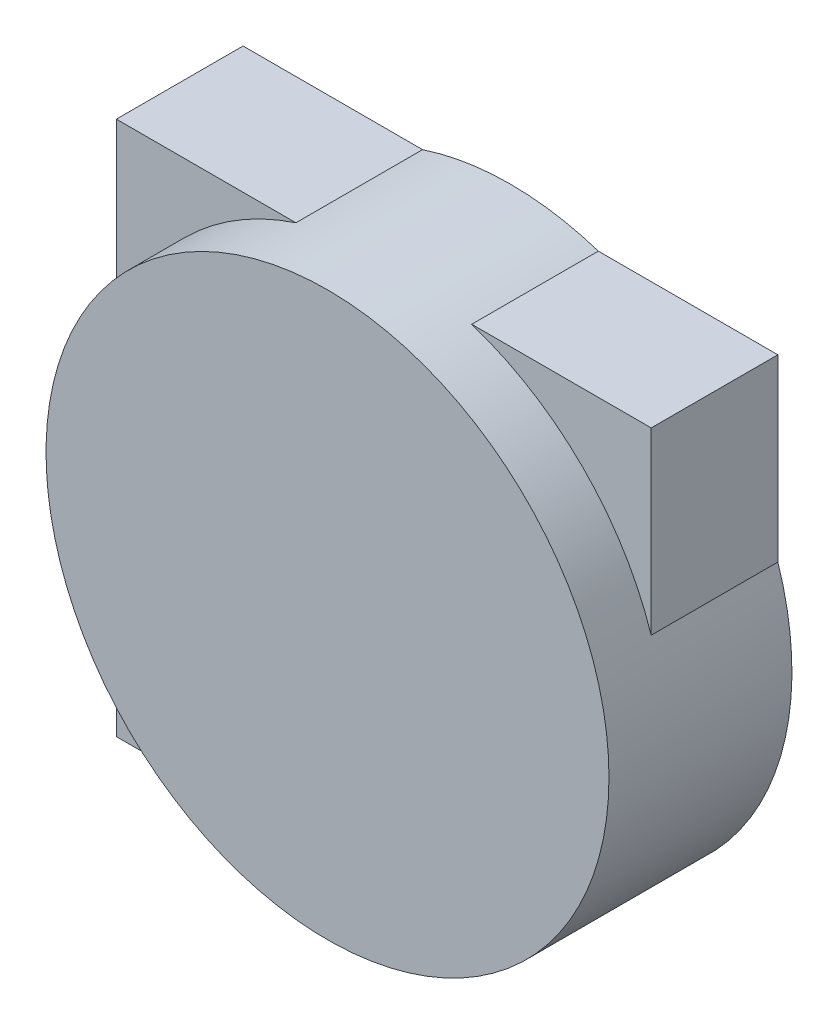
ISO-10303-21;
HEADER;
FILE_DESCRIPTION(('STEP AP214'),'2;1');
FILE_NAME('part.step','',(''),(''),'','','');
FILE_SCHEMA(('AUTOMOTIVE_DESIGN { 1 0 10303 214 1 1 1 1 }'));
ENDSEC;
DATA;
#1=APPLICATION_CONTEXT('core data for automotive mechanical design processes');
#2=APPLICATION_PROTOCOL_DEFINITION('international standard','automotive_design',2000,#1);
#3=PRODUCT_CONTEXT('',#1,'mechanical');
#4=PRODUCT('Part','Part','',(#3));
#5=PRODUCT_RELATED_PRODUCT_CATEGORY('part','',(#4));
#6=PRODUCT_DEFINITION_FORMATION('','',#4);
#7=PRODUCT_DEFINITION_CONTEXT('part definition',#1,'design');
#8=PRODUCT_DEFINITION('design','',#6,#7);
#9=PRODUCT_DEFINITION_SHAPE('','',#8);
#10=(LENGTH_UNIT() NAMED_UNIT(*) SI_UNIT(.MILLI.,.METRE.));
#11=(NAMED_UNIT(*) PLANE_ANGLE_UNIT() SI_UNIT($,.RADIAN.));
#12=(NAMED_UNIT(*) SI_UNIT($,.STERADIAN.) SOLID_ANGLE_UNIT());
#13=UNCERTAINTY_MEASURE_WITH_UNIT(LENGTH_MEASURE(1.E-05),#10,'distance_accuracy_value','');
#14=(GEOMETRIC_REPRESENTATION_CONTEXT(3) GLOBAL_UNCERTAINTY_ASSIGNED_CONTEXT((#13)) GLOBAL_UNIT_ASSIGNED_CONTEXT((#10,
#11,#12)) REPRESENTATION_CONTEXT('',''));
#15=CARTESIAN_POINT('',(0.,0.,0.));
#16=DIRECTION('',(0.,0.,1.));
#17=DIRECTION('',(1.,0.,0.));
#18=AXIS2_PLACEMENT_3D('',#15,#16,#17);
#19=CARTESIAN_POINT('',(0.,0.,13.));
#20=DIRECTION('',(0.,0.,-1.));
#21=DIRECTION('',(-1.,0.,0.));
#22=AXIS2_PLACEMENT_3D('',#19,#20,#21);
#23=CYLINDRICAL_SURFACE('',#22,20.);
#24=CARTESIAN_POINT('',(0.,0.,0.));
#25=DIRECTION('',(0.,0.,1.));
#26=DIRECTION('',(1.,0.,0.));
#27=AXIS2_PLACEMENT_3D('',#24,#25,#26);
#28=CIRCLE('',#27,20.);
#29=CARTESIAN_POINT('',(-6.24499799839837,-19.,0.));
#30=VERTEX_POINT('',#29);
#31=CARTESIAN_POINT('',(19.,6.2449979983984,0.));
#32=VERTEX_POINT('',#31);
#33=EDGE_CURVE('E160',#30,#32,#28,.T.);
#34=ORIENTED_EDGE('',*,*,#33,.T.);
#35=DIRECTION('',(0.,0.,-1.));
#36=VECTOR('',#35,1.);
#37=CARTESIAN_POINT('',(19.,6.2449979983984,13.));
#38=LINE('',#37,#36);
#39=CARTESIAN_POINT('',(19.,6.2449979983984,9.));
#40=VERTEX_POINT('',#39);
#41=EDGE_CURVE('E158',#32,#40,#38,.F.);
#42=ORIENTED_EDGE('',*,*,#41,.T.);
#43=CARTESIAN_POINT('',(0.,0.,9.));
#44=DIRECTION('',(0.,0.,-1.));
#45=DIRECTION('',(-1.,0.,0.));
#46=AXIS2_PLACEMENT_3D('',#43,#44,#45);
#47=CIRCLE('',#46,20.);
#48=CARTESIAN_POINT('',(6.24499799839839,19.,9.));
#49=VERTEX_POINT('',#48);
#50=EDGE_CURVE('E41',#49,#40,#47,.T.);
#51=ORIENTED_EDGE('',*,*,#50,.F.);
#52=DIRECTION('',(0.,0.,-1.));
#53=VECTOR('',#52,1.);
#54=CARTESIAN_POINT('',(6.24499799839839,19.,13.));
#55=LINE('',#54,#53);
#56=CARTESIAN_POINT('',(6.24499799839839,19.,0.));
#57=VERTEX_POINT('',#56);
#58=EDGE_CURVE('E155',#49,#57,#55,.T.);
#59=ORIENTED_EDGE('',*,*,#58,.T.);
#60=CARTESIAN_POINT('',(-6.24499799839839,19.,0.));
#61=VERTEX_POINT('',#60);
#62=EDGE_CURVE('E163',#57,#61,#28,.T.);
#63=ORIENTED_EDGE('',*,*,#62,.T.);
#64=DIRECTION('',(0.,0.,-1.));
#65=VECTOR('',#64,1.);
#66=CARTESIAN_POINT('',(-6.24499799839839,19.,13.));
#67=LINE('',#66,#65);
#68=CARTESIAN_POINT('',(-6.24499799839839,19.,9.));
#69=VERTEX_POINT('',#68);
#70=EDGE_CURVE('E48',#61,#69,#67,.F.);
#71=ORIENTED_EDGE('',*,*,#70,.T.);
#72=CARTESIAN_POINT('',(-19.,6.24499799839838,9.));
#73=VERTEX_POINT('',#72);
#74=EDGE_CURVE('E11',#73,#69,#47,.T.);
#75=ORIENTED_EDGE('',*,*,#74,.F.);
#76=DIRECTION('',(0.,0.,-1.));
#77=VECTOR('',#76,1.);
#78=CARTESIAN_POINT('',(-19.,6.24499799839839,13.));
#79=LINE('',#78,#77);
#80=CARTESIAN_POINT('',(-19.,6.24499799839839,0.));
#81=VERTEX_POINT('',#80);
#82=EDGE_CURVE('E152',#73,#81,#79,.T.);
#83=ORIENTED_EDGE('',*,*,#82,.T.);
#84=CARTESIAN_POINT('',(-19.,-6.24499799839838,0.));
#85=VERTEX_POINT('',#84);
#86=EDGE_CURVE('E164',#81,#85,#28,.T.);
#87=ORIENTED_EDGE('',*,*,#86,.T.);
#88=DIRECTION('',(0.,0.,-1.));
#89=VECTOR('',#88,1.);
#90=CARTESIAN_POINT('',(-19.,-6.24499799839838,13.));
#91=LINE('',#90,#89);
#92=CARTESIAN_POINT('',(-19.,-6.24499799839838,9.));
#93=VERTEX_POINT('',#92);
#94=EDGE_CURVE('E150',#85,#93,#91,.F.);
#95=ORIENTED_EDGE('',*,*,#94,.T.);
#96=CARTESIAN_POINT('',(-6.24499799839838,-19.,9.));
#97=VERTEX_POINT('',#96);
#98=EDGE_CURVE('E36',#97,#93,#47,.T.);
#99=ORIENTED_EDGE('',*,*,#98,.F.);
#100=DIRECTION('',(0.,0.,-1.));
#101=VECTOR('',#100,1.);
#102=CARTESIAN_POINT('',(-6.24499799839837,-19.,13.));
#103=LINE('',#102,#101);
#104=EDGE_CURVE('E109',#97,#30,#103,.T.);
#105=ORIENTED_EDGE('',*,*,#104,.T.);
#106=EDGE_LOOP('',(#34,#42,#51,#59,#63,#71,#75,#83,#87,#95,#99,#105));
#107=FACE_BOUND('',#106,.T.);
#108=CARTESIAN_POINT('',(0.,0.,13.));
#109=DIRECTION('',(0.,0.,1.));
#110=DIRECTION('',(1.,0.,0.));
#111=AXIS2_PLACEMENT_3D('',#108,#109,#110);
#112=CIRCLE('',#111,20.);
#113=CARTESIAN_POINT('',(20.,0.,13.));
#114=VERTEX_POINT('',#113);
#115=EDGE_CURVE('E161',#114,#114,#112,.T.);
#116=ORIENTED_EDGE('',*,*,#115,.F.);
#117=EDGE_LOOP('',(#116));
#118=FACE_BOUND('',#117,.T.);
#119=ADVANCED_FACE('F33',(#107,#118),#23,.T.);
#120=CARTESIAN_POINT('',(0.,0.,13.));
#121=DIRECTION('',(0.,0.,1.));
#122=DIRECTION('',(1.,0.,0.));
#123=AXIS2_PLACEMENT_3D('',#120,#121,#122);
#124=PLANE('',#123);
#125=ORIENTED_EDGE('',*,*,#115,.T.);
#126=EDGE_LOOP('',(#125));
#127=FACE_BOUND('',#126,.T.);
#128=ADVANCED_FACE('F198',(#127),#124,.T.);
#129=CARTESIAN_POINT('',(0.,0.,0.));
#130=DIRECTION('',(0.,0.,1.));
#131=DIRECTION('',(1.,0.,0.));
#132=AXIS2_PLACEMENT_3D('',#129,#130,#131);
#133=PLANE('',#132);
#134=ORIENTED_EDGE('',*,*,#33,.F.);
#135=DIRECTION('',(-1.,0.,0.));
#136=VECTOR('',#135,1.);
#137=CARTESIAN_POINT('',(6.24499799839837,-19.,0.));
#138=LINE('',#137,#136);
#139=CARTESIAN_POINT('',(-19.,-19.,0.));
#140=VERTEX_POINT('',#139);
#141=EDGE_CURVE('E136',#30,#140,#138,.T.);
#142=ORIENTED_EDGE('',*,*,#141,.T.);
#143=DIRECTION('',(0.,1.,0.));
#144=VECTOR('',#143,1.);
#145=CARTESIAN_POINT('',(-19.,19.,0.));
#146=LINE('',#145,#144);
#147=EDGE_CURVE('E122',#140,#85,#146,.T.);
#148=ORIENTED_EDGE('',*,*,#147,.T.);
#149=ORIENTED_EDGE('',*,*,#86,.F.);
#150=CARTESIAN_POINT('',(-19.,19.,0.));
#151=VERTEX_POINT('',#150);
#152=EDGE_CURVE('E138',#81,#151,#146,.T.);
#153=ORIENTED_EDGE('',*,*,#152,.T.);
#154=DIRECTION('',(1.,0.,0.));
#155=VECTOR('',#154,1.);
#156=CARTESIAN_POINT('',(19.,19.,0.));
#157=LINE('',#156,#155);
#158=EDGE_CURVE('E141',#151,#61,#157,.T.);
#159=ORIENTED_EDGE('',*,*,#158,.T.);
#160=ORIENTED_EDGE('',*,*,#62,.F.);
#161=CARTESIAN_POINT('',(19.,19.,0.));
#162=VERTEX_POINT('',#161);
#163=EDGE_CURVE('E140',#57,#162,#157,.T.);
#164=ORIENTED_EDGE('',*,*,#163,.T.);
#165=DIRECTION('',(0.,-1.,0.));
#166=VECTOR('',#165,1.);
#167=CARTESIAN_POINT('',(19.,19.,0.));
#168=LINE('',#167,#166);
#169=EDGE_CURVE('E133',#162,#32,#168,.T.);
#170=ORIENTED_EDGE('',*,*,#169,.T.);
#171=EDGE_LOOP('',(#134,#142,#148,#149,#153,#159,#160,#164,#170));
#172=FACE_BOUND('',#171,.T.);
#173=ADVANCED_FACE('F175',(#172),#133,.F.);
#174=CARTESIAN_POINT('',(0.,0.,9.));
#175=DIRECTION('',(0.,0.,-1.));
#176=DIRECTION('',(-1.,0.,0.));
#177=AXIS2_PLACEMENT_3D('',#174,#175,#176);
#178=PLANE('',#177);
#179=DIRECTION('',(-1.,0.,0.));
#180=VECTOR('',#179,1.);
#181=CARTESIAN_POINT('',(6.24499799839837,-19.,9.));
#182=LINE('',#181,#180);
#183=CARTESIAN_POINT('',(-19.,-19.,9.));
#184=VERTEX_POINT('',#183);
#185=EDGE_CURVE('E102',#97,#184,#182,.T.);
#186=ORIENTED_EDGE('',*,*,#185,.F.);
#187=ORIENTED_EDGE('',*,*,#98,.T.);
#188=DIRECTION('',(0.,1.,0.));
#189=VECTOR('',#188,1.);
#190=CARTESIAN_POINT('',(-19.,19.,9.));
#191=LINE('',#190,#189);
#192=EDGE_CURVE('E120',#184,#93,#191,.T.);
#193=ORIENTED_EDGE('',*,*,#192,.F.);
#194=EDGE_LOOP('',(#186,#187,#193));
#195=FACE_BOUND('',#194,.T.);
#196=ADVANCED_FACE('F126',(#195),#178,.F.);
#197=CARTESIAN_POINT('',(6.24499799839837,-19.,9.));
#198=DIRECTION('',(0.,-1.,0.));
#199=DIRECTION('',(1.,0.,0.));
#200=AXIS2_PLACEMENT_3D('',#197,#198,#199);
#201=PLANE('',#200);
#202=ORIENTED_EDGE('',*,*,#104,.F.);
#203=ORIENTED_EDGE('',*,*,#185,.T.);
#204=DIRECTION('',(0.,0.,-1.));
#205=VECTOR('',#204,1.);
#206=CARTESIAN_POINT('',(-19.,-19.,9.));
#207=LINE('',#206,#205);
#208=EDGE_CURVE('E106',#184,#140,#207,.T.);
#209=ORIENTED_EDGE('',*,*,#208,.T.);
#210=ORIENTED_EDGE('',*,*,#141,.F.);
#211=EDGE_LOOP('',(#202,#203,#209,#210));
#212=FACE_BOUND('',#211,.T.);
#213=ADVANCED_FACE('F104',(#212),#201,.T.);
#214=CARTESIAN_POINT('',(-19.,19.,9.));
#215=DIRECTION('',(-1.,0.,0.));
#216=DIRECTION('',(0.,-1.,0.));
#217=AXIS2_PLACEMENT_3D('',#214,#215,#216);
#218=PLANE('',#217);
#219=ORIENTED_EDGE('',*,*,#94,.F.);
#220=ORIENTED_EDGE('',*,*,#147,.F.);
#221=ORIENTED_EDGE('',*,*,#208,.F.);
#222=ORIENTED_EDGE('',*,*,#192,.T.);
#223=EDGE_LOOP('',(#219,#220,#221,#222));
#224=FACE_BOUND('',#223,.T.);
#225=ADVANCED_FACE('F119',(#224),#218,.T.);
#226=DIRECTION('',(1.,0.,0.));
#227=VECTOR('',#226,1.);
#228=CARTESIAN_POINT('',(19.,19.,9.));
#229=LINE('',#228,#227);
#230=CARTESIAN_POINT('',(19.,19.,9.));
#231=VERTEX_POINT('',#230);
#232=EDGE_CURVE('E127',#49,#231,#229,.T.);
#233=ORIENTED_EDGE('',*,*,#232,.F.);
#234=ORIENTED_EDGE('',*,*,#50,.T.);
#235=DIRECTION('',(0.,-1.,0.));
#236=VECTOR('',#235,1.);
#237=CARTESIAN_POINT('',(19.,19.,9.));
#238=LINE('',#237,#236);
#239=EDGE_CURVE('E114',#231,#40,#238,.T.);
#240=ORIENTED_EDGE('',*,*,#239,.F.);
#241=EDGE_LOOP('',(#233,#234,#240));
#242=FACE_BOUND('',#241,.T.);
#243=ADVANCED_FACE('F185',(#242),#178,.F.);
#244=CARTESIAN_POINT('',(19.,19.,9.));
#245=DIRECTION('',(0.,1.,0.));
#246=DIRECTION('',(0.,0.,1.));
#247=AXIS2_PLACEMENT_3D('',#244,#245,#246);
#248=PLANE('',#247);
#249=ORIENTED_EDGE('',*,*,#58,.F.);
#250=ORIENTED_EDGE('',*,*,#232,.T.);
#251=DIRECTION('',(0.,0.,-1.));
#252=VECTOR('',#251,1.);
#253=CARTESIAN_POINT('',(19.,19.,9.));
#254=LINE('',#253,#252);
#255=EDGE_CURVE('E144',#231,#162,#254,.T.);
#256=ORIENTED_EDGE('',*,*,#255,.T.);
#257=ORIENTED_EDGE('',*,*,#163,.F.);
#258=EDGE_LOOP('',(#249,#250,#256,#257));
#259=FACE_BOUND('',#258,.T.);
#260=ADVANCED_FACE('F191',(#259),#248,.T.);
#261=CARTESIAN_POINT('',(19.,19.,9.));
#262=DIRECTION('',(1.,0.,0.));
#263=DIRECTION('',(0.,1.,0.));
#264=AXIS2_PLACEMENT_3D('',#261,#262,#263);
#265=PLANE('',#264);
#266=ORIENTED_EDGE('',*,*,#41,.F.);
#267=ORIENTED_EDGE('',*,*,#169,.F.);
#268=ORIENTED_EDGE('',*,*,#255,.F.);
#269=ORIENTED_EDGE('',*,*,#239,.T.);
#270=EDGE_LOOP('',(#266,#267,#268,#269));
#271=FACE_BOUND('',#270,.T.);
#272=ADVANCED_FACE('F183',(#271),#265,.T.);
#273=CARTESIAN_POINT('',(-19.,19.,9.));
#274=VERTEX_POINT('',#273);
#275=EDGE_CURVE('E113',#73,#274,#191,.T.);
#276=ORIENTED_EDGE('',*,*,#275,.F.);
#277=ORIENTED_EDGE('',*,*,#74,.T.);
#278=EDGE_CURVE('E124',#274,#69,#229,.T.);
#279=ORIENTED_EDGE('',*,*,#278,.F.);
#280=EDGE_LOOP('',(#276,#277,#279));
#281=FACE_BOUND('',#280,.T.);
#282=ADVANCED_FACE('F181',(#281),#178,.F.);
#283=ORIENTED_EDGE('',*,*,#70,.F.);
#284=ORIENTED_EDGE('',*,*,#158,.F.);
#285=DIRECTION('',(0.,0.,-1.));
#286=VECTOR('',#285,1.);
#287=CARTESIAN_POINT('',(-19.,19.,9.));
#288=LINE('',#287,#286);
#289=EDGE_CURVE('E123',#274,#151,#288,.T.);
#290=ORIENTED_EDGE('',*,*,#289,.F.);
#291=ORIENTED_EDGE('',*,*,#278,.T.);
#292=EDGE_LOOP('',(#283,#284,#290,#291));
#293=FACE_BOUND('',#292,.T.);
#294=ADVANCED_FACE('F172',(#293),#248,.T.);
#295=ORIENTED_EDGE('',*,*,#82,.F.);
#296=ORIENTED_EDGE('',*,*,#275,.T.);
#297=ORIENTED_EDGE('',*,*,#289,.T.);
#298=ORIENTED_EDGE('',*,*,#152,.F.);
#299=EDGE_LOOP('',(#295,#296,#297,#298));
#300=FACE_BOUND('',#299,.T.);
#301=ADVANCED_FACE('F178',(#300),#218,.T.);
#302=CLOSED_SHELL('',(#119,#128,#173,#196,#213,#225,#243,#260,#272,#282,#294,#301));
#303=MANIFOLD_SOLID_BREP('B2',#302);
#304=ADVANCED_BREP_SHAPE_REPRESENTATION('',(#18,#303),#14);
#305=SHAPE_DEFINITION_REPRESENTATION(#9,#304);
ENDSEC;
END-ISO-10303-21;
